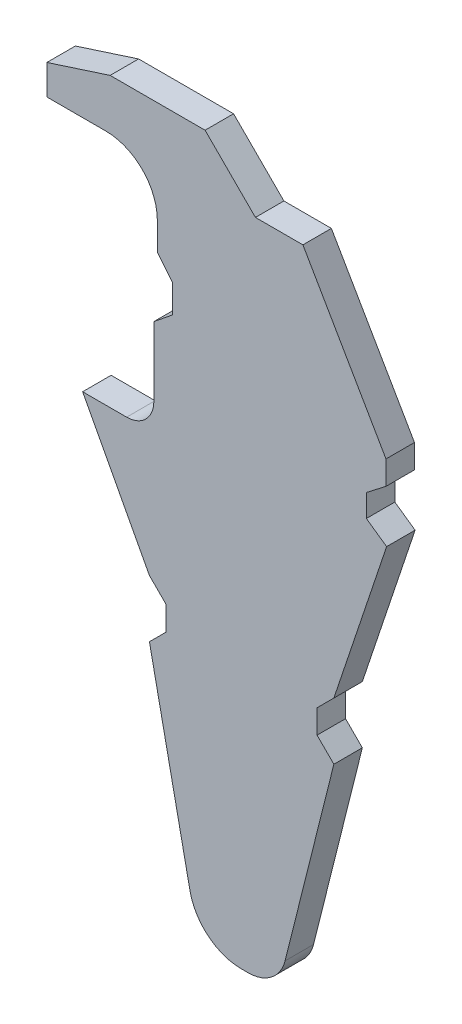
ISO-10303-21;
HEADER;
FILE_DESCRIPTION(('STEP AP214'),'2;1');
FILE_NAME('part.step','',(''),(''),'','','');
FILE_SCHEMA(('AUTOMOTIVE_DESIGN { 1 0 10303 214 1 1 1 1 }'));
ENDSEC;
DATA;
#1=APPLICATION_CONTEXT('core data for automotive mechanical design processes');
#2=APPLICATION_PROTOCOL_DEFINITION('international standard','automotive_design',2000,#1);
#3=PRODUCT_CONTEXT('',#1,'mechanical');
#4=PRODUCT('Part','Part','',(#3));
#5=PRODUCT_RELATED_PRODUCT_CATEGORY('part','',(#4));
#6=PRODUCT_DEFINITION_FORMATION('','',#4);
#7=PRODUCT_DEFINITION_CONTEXT('part definition',#1,'design');
#8=PRODUCT_DEFINITION('design','',#6,#7);
#9=PRODUCT_DEFINITION_SHAPE('','',#8);
#10=(LENGTH_UNIT() NAMED_UNIT(*) SI_UNIT(.MILLI.,.METRE.));
#11=(NAMED_UNIT(*) PLANE_ANGLE_UNIT() SI_UNIT($,.RADIAN.));
#12=(NAMED_UNIT(*) SI_UNIT($,.STERADIAN.) SOLID_ANGLE_UNIT());
#13=UNCERTAINTY_MEASURE_WITH_UNIT(LENGTH_MEASURE(1.E-05),#10,'distance_accuracy_value','');
#14=(GEOMETRIC_REPRESENTATION_CONTEXT(3) GLOBAL_UNCERTAINTY_ASSIGNED_CONTEXT((#13)) GLOBAL_UNIT_ASSIGNED_CONTEXT((#10,
#11,#12)) REPRESENTATION_CONTEXT('',''));
#15=CARTESIAN_POINT('',(0.,0.,0.));
#16=DIRECTION('',(0.,0.,1.));
#17=DIRECTION('',(1.,0.,0.));
#18=AXIS2_PLACEMENT_3D('',#15,#16,#17);
#19=CARTESIAN_POINT('',(-67.2955021445661,57.9711855069026,6.));
#20=DIRECTION('',(0.307214021508305,-0.951640449428614,0.));
#21=DIRECTION('',(0.951640449428614,0.307214021508305,0.));
#22=AXIS2_PLACEMENT_3D('',#19,#20,#21);
#23=PLANE('',#22);
#24=DIRECTION('',(-0.951640449428614,-0.307214021508305,0.));
#25=VECTOR('',#24,1.);
#26=CARTESIAN_POINT('',(-67.2955021445661,57.9711855069026,0.));
#27=LINE('',#26,#25);
#28=CARTESIAN_POINT('',(-53.9725358525655,62.2721818080188,0.));
#29=VERTEX_POINT('',#28);
#30=CARTESIAN_POINT('',(-67.2955021445661,57.9711855069026,0.));
#31=VERTEX_POINT('',#30);
#32=EDGE_CURVE('E273',#29,#31,#27,.T.);
#33=ORIENTED_EDGE('',*,*,#32,.T.);
#34=DIRECTION('',(0.,0.,-1.));
#35=VECTOR('',#34,1.);
#36=CARTESIAN_POINT('',(-67.2955021445661,57.9711855069026,6.));
#37=LINE('',#36,#35);
#38=CARTESIAN_POINT('',(-67.2955021445661,57.9711855069026,6.));
#39=VERTEX_POINT('',#38);
#40=EDGE_CURVE('E11',#39,#31,#37,.T.);
#41=ORIENTED_EDGE('',*,*,#40,.F.);
#42=DIRECTION('',(-0.951640449428614,-0.307214021508305,0.));
#43=VECTOR('',#42,1.);
#44=CARTESIAN_POINT('',(-67.2955021445661,57.9711855069026,6.));
#45=LINE('',#44,#43);
#46=CARTESIAN_POINT('',(-53.9725358525655,62.2721818080188,6.));
#47=VERTEX_POINT('',#46);
#48=EDGE_CURVE('E335',#47,#39,#45,.T.);
#49=ORIENTED_EDGE('',*,*,#48,.F.);
#50=DIRECTION('',(0.,0.,-1.));
#51=VECTOR('',#50,1.);
#52=CARTESIAN_POINT('',(-53.9725358525655,62.2721818080188,6.));
#53=LINE('',#52,#51);
#54=EDGE_CURVE('E269',#47,#29,#53,.T.);
#55=ORIENTED_EDGE('',*,*,#54,.T.);
#56=EDGE_LOOP('',(#33,#41,#49,#55));
#57=FACE_BOUND('',#56,.T.);
#58=ADVANCED_FACE('F33',(#57),#23,.F.);
#59=CARTESIAN_POINT('',(-67.2955021445661,57.9711855069026,6.));
#60=DIRECTION('',(1.,0.,0.));
#61=DIRECTION('',(0.,0.,-1.));
#62=AXIS2_PLACEMENT_3D('',#59,#60,#61);
#63=PLANE('',#62);
#64=DIRECTION('',(0.,-1.,0.));
#65=VECTOR('',#64,1.);
#66=CARTESIAN_POINT('',(-67.2955021445661,57.9711855069026,0.));
#67=LINE('',#66,#65);
#68=CARTESIAN_POINT('',(-67.2955021445661,51.6655800902206,0.));
#69=VERTEX_POINT('',#68);
#70=EDGE_CURVE('E276',#31,#69,#67,.T.);
#71=ORIENTED_EDGE('',*,*,#70,.T.);
#72=DIRECTION('',(0.,0.,-1.));
#73=VECTOR('',#72,1.);
#74=CARTESIAN_POINT('',(-67.2955021445661,51.6655800902206,6.));
#75=LINE('',#74,#73);
#76=CARTESIAN_POINT('',(-67.2955021445661,51.6655800902206,6.));
#77=VERTEX_POINT('',#76);
#78=EDGE_CURVE('E41',#77,#69,#75,.T.);
#79=ORIENTED_EDGE('',*,*,#78,.F.);
#80=DIRECTION('',(0.,-1.,0.));
#81=VECTOR('',#80,1.);
#82=CARTESIAN_POINT('',(-67.2955021445661,57.9711855069026,6.));
#83=LINE('',#82,#81);
#84=EDGE_CURVE('E164',#39,#77,#83,.T.);
#85=ORIENTED_EDGE('',*,*,#84,.F.);
#86=ORIENTED_EDGE('',*,*,#40,.T.);
#87=EDGE_LOOP('',(#71,#79,#85,#86));
#88=FACE_BOUND('',#87,.T.);
#89=ADVANCED_FACE('F513',(#88),#63,.F.);
#90=CARTESIAN_POINT('',(-67.2955021445661,51.6655800902206,6.));
#91=DIRECTION('',(0.,1.,0.));
#92=DIRECTION('',(0.,0.,1.));
#93=AXIS2_PLACEMENT_3D('',#90,#91,#92);
#94=PLANE('',#93);
#95=DIRECTION('',(1.,0.,0.));
#96=VECTOR('',#95,1.);
#97=CARTESIAN_POINT('',(-67.2955021445661,51.6655800902206,0.));
#98=LINE('',#97,#96);
#99=CARTESIAN_POINT('',(-54.8708551394031,51.6655800902206,0.));
#100=VERTEX_POINT('',#99);
#101=EDGE_CURVE('E278',#69,#100,#98,.T.);
#102=ORIENTED_EDGE('',*,*,#101,.T.);
#103=DIRECTION('',(0.,0.,-1.));
#104=VECTOR('',#103,1.);
#105=CARTESIAN_POINT('',(-54.8708551394031,51.6655800902206,6.));
#106=LINE('',#105,#104);
#107=CARTESIAN_POINT('',(-54.8708551394031,51.6655800902206,6.));
#108=VERTEX_POINT('',#107);
#109=EDGE_CURVE('E414',#108,#100,#106,.T.);
#110=ORIENTED_EDGE('',*,*,#109,.F.);
#111=DIRECTION('',(1.,0.,0.));
#112=VECTOR('',#111,1.);
#113=CARTESIAN_POINT('',(-67.2955021445661,51.6655800902206,6.));
#114=LINE('',#113,#112);
#115=EDGE_CURVE('E422',#77,#108,#114,.T.);
#116=ORIENTED_EDGE('',*,*,#115,.F.);
#117=ORIENTED_EDGE('',*,*,#78,.T.);
#118=EDGE_LOOP('',(#102,#110,#116,#117));
#119=FACE_BOUND('',#118,.T.);
#120=ADVANCED_FACE('F420',(#119),#94,.F.);
#121=CARTESIAN_POINT('',(-54.8708551394031,40.8223313035777,6.));
#122=DIRECTION('',(0.,0.,-1.));
#123=DIRECTION('',(-1.,0.,0.));
#124=AXIS2_PLACEMENT_3D('',#121,#122,#123);
#125=CYLINDRICAL_SURFACE('',#124,10.8432487866429);
#126=CARTESIAN_POINT('',(-54.8708551394031,40.8223313035777,0.));
#127=DIRECTION('',(0.,0.,-1.));
#128=DIRECTION('',(-1.,0.,0.));
#129=AXIS2_PLACEMENT_3D('',#126,#127,#128);
#130=CIRCLE('',#129,10.8432487866429);
#131=CARTESIAN_POINT('',(-44.0276063527602,40.8223313035777,0.));
#132=VERTEX_POINT('',#131);
#133=EDGE_CURVE('E280',#100,#132,#130,.T.);
#134=ORIENTED_EDGE('',*,*,#133,.T.);
#135=DIRECTION('',(0.,0.,-1.));
#136=VECTOR('',#135,1.);
#137=CARTESIAN_POINT('',(-44.0276063527602,40.8223313035777,6.));
#138=LINE('',#137,#136);
#139=CARTESIAN_POINT('',(-44.0276063527602,40.8223313035777,6.));
#140=VERTEX_POINT('',#139);
#141=EDGE_CURVE('E411',#140,#132,#138,.T.);
#142=ORIENTED_EDGE('',*,*,#141,.F.);
#143=CARTESIAN_POINT('',(-54.8708551394031,40.8223313035777,6.));
#144=DIRECTION('',(0.,0.,-1.));
#145=DIRECTION('',(-1.,0.,0.));
#146=AXIS2_PLACEMENT_3D('',#143,#144,#145);
#147=CIRCLE('',#146,10.8432487866429);
#148=EDGE_CURVE('E440',#108,#140,#147,.T.);
#149=ORIENTED_EDGE('',*,*,#148,.F.);
#150=ORIENTED_EDGE('',*,*,#109,.T.);
#151=EDGE_LOOP('',(#134,#142,#149,#150));
#152=FACE_BOUND('',#151,.T.);
#153=ADVANCED_FACE('F431',(#152),#125,.F.);
#154=CARTESIAN_POINT('',(-44.0276063527602,40.8223313035777,6.));
#155=DIRECTION('',(1.,0.,0.));
#156=DIRECTION('',(0.,0.,-1.));
#157=AXIS2_PLACEMENT_3D('',#154,#155,#156);
#158=PLANE('',#157);
#159=DIRECTION('',(0.,-1.,0.));
#160=VECTOR('',#159,1.);
#161=CARTESIAN_POINT('',(-44.0276063527602,40.8223313035777,0.));
#162=LINE('',#161,#160);
#163=CARTESIAN_POINT('',(-44.0276063527602,34.9937885514415,0.));
#164=VERTEX_POINT('',#163);
#165=EDGE_CURVE('E282',#132,#164,#162,.T.);
#166=ORIENTED_EDGE('',*,*,#165,.T.);
#167=DIRECTION('',(0.,0.,-1.));
#168=VECTOR('',#167,1.);
#169=CARTESIAN_POINT('',(-44.0276063527602,34.9937885514415,6.));
#170=LINE('',#169,#168);
#171=CARTESIAN_POINT('',(-44.0276063527602,34.9937885514415,6.));
#172=VERTEX_POINT('',#171);
#173=EDGE_CURVE('E408',#172,#164,#170,.T.);
#174=ORIENTED_EDGE('',*,*,#173,.F.);
#175=DIRECTION('',(0.,-1.,0.));
#176=VECTOR('',#175,1.);
#177=CARTESIAN_POINT('',(-44.0276063527602,40.8223313035777,6.));
#178=LINE('',#177,#176);
#179=EDGE_CURVE('E437',#140,#172,#178,.T.);
#180=ORIENTED_EDGE('',*,*,#179,.F.);
#181=ORIENTED_EDGE('',*,*,#141,.T.);
#182=EDGE_LOOP('',(#166,#174,#180,#181));
#183=FACE_BOUND('',#182,.T.);
#184=ADVANCED_FACE('F435',(#183),#158,.F.);
#185=CARTESIAN_POINT('',(-40.8811187330478,31.1079661598501,6.));
#186=DIRECTION('',(0.777164478318329,0.629297523942531,0.));
#187=DIRECTION('',(-0.629297523942531,0.777164478318329,0.));
#188=AXIS2_PLACEMENT_3D('',#185,#186,#187);
#189=PLANE('',#188);
#190=DIRECTION('',(0.629297523942531,-0.777164478318329,0.));
#191=VECTOR('',#190,1.);
#192=CARTESIAN_POINT('',(-40.8811187330478,31.1079661598501,0.));
#193=LINE('',#192,#191);
#194=CARTESIAN_POINT('',(-40.8811187330478,31.1079661598501,0.));
#195=VERTEX_POINT('',#194);
#196=EDGE_CURVE('E284',#164,#195,#193,.T.);
#197=ORIENTED_EDGE('',*,*,#196,.T.);
#198=DIRECTION('',(0.,0.,-1.));
#199=VECTOR('',#198,1.);
#200=CARTESIAN_POINT('',(-40.8811187330478,31.1079661598501,6.));
#201=LINE('',#200,#199);
#202=CARTESIAN_POINT('',(-40.8811187330478,31.1079661598501,6.));
#203=VERTEX_POINT('',#202);
#204=EDGE_CURVE('E405',#203,#195,#201,.T.);
#205=ORIENTED_EDGE('',*,*,#204,.F.);
#206=DIRECTION('',(0.629297523942531,-0.777164478318329,0.));
#207=VECTOR('',#206,1.);
#208=CARTESIAN_POINT('',(-40.8811187330478,31.1079661598501,6.));
#209=LINE('',#208,#207);
#210=EDGE_CURVE('E439',#172,#203,#209,.T.);
#211=ORIENTED_EDGE('',*,*,#210,.F.);
#212=ORIENTED_EDGE('',*,*,#173,.T.);
#213=EDGE_LOOP('',(#197,#205,#211,#212));
#214=FACE_BOUND('',#213,.T.);
#215=ADVANCED_FACE('F526',(#214),#189,.F.);
#216=CARTESIAN_POINT('',(-40.8811187330478,25.1079661598501,6.));
#217=DIRECTION('',(1.,0.,0.));
#218=DIRECTION('',(0.,0.,-1.));
#219=AXIS2_PLACEMENT_3D('',#216,#217,#218);
#220=PLANE('',#219);
#221=DIRECTION('',(0.,-1.,0.));
#222=VECTOR('',#221,1.);
#223=CARTESIAN_POINT('',(-40.8811187330478,25.1079661598501,0.));
#224=LINE('',#223,#222);
#225=CARTESIAN_POINT('',(-40.8811187330478,25.1079661598501,0.));
#226=VERTEX_POINT('',#225);
#227=EDGE_CURVE('E286',#195,#226,#224,.T.);
#228=ORIENTED_EDGE('',*,*,#227,.T.);
#229=DIRECTION('',(0.,0.,-1.));
#230=VECTOR('',#229,1.);
#231=CARTESIAN_POINT('',(-40.8811187330478,25.1079661598501,6.));
#232=LINE('',#231,#230);
#233=CARTESIAN_POINT('',(-40.8811187330478,25.1079661598501,6.));
#234=VERTEX_POINT('',#233);
#235=EDGE_CURVE('E402',#234,#226,#232,.T.);
#236=ORIENTED_EDGE('',*,*,#235,.F.);
#237=DIRECTION('',(0.,-1.,0.));
#238=VECTOR('',#237,1.);
#239=CARTESIAN_POINT('',(-40.8811187330478,25.1079661598501,6.));
#240=LINE('',#239,#238);
#241=EDGE_CURVE('E442',#203,#234,#240,.T.);
#242=ORIENTED_EDGE('',*,*,#241,.F.);
#243=ORIENTED_EDGE('',*,*,#204,.T.);
#244=EDGE_LOOP('',(#228,#236,#242,#243));
#245=FACE_BOUND('',#244,.T.);
#246=ADVANCED_FACE('F529',(#245),#220,.F.);
#247=CARTESIAN_POINT('',(-44.7669411246306,21.9614785401446,6.));
#248=DIRECTION('',(0.62929752394253,-0.777164478318329,0.));
#249=DIRECTION('',(0.777164478318329,0.62929752394253,0.));
#250=AXIS2_PLACEMENT_3D('',#247,#248,#249);
#251=PLANE('',#250);
#252=DIRECTION('',(-0.777164478318329,-0.62929752394253,0.));
#253=VECTOR('',#252,1.);
#254=CARTESIAN_POINT('',(-44.7669411246306,21.9614785401446,0.));
#255=LINE('',#254,#253);
#256=CARTESIAN_POINT('',(-44.7669411246306,21.9614785401446,0.));
#257=VERTEX_POINT('',#256);
#258=EDGE_CURVE('E288',#226,#257,#255,.T.);
#259=ORIENTED_EDGE('',*,*,#258,.T.);
#260=DIRECTION('',(0.,0.,-1.));
#261=VECTOR('',#260,1.);
#262=CARTESIAN_POINT('',(-44.7669411246306,21.9614785401446,6.));
#263=LINE('',#262,#261);
#264=CARTESIAN_POINT('',(-44.7669411246306,21.9614785401446,6.));
#265=VERTEX_POINT('',#264);
#266=EDGE_CURVE('E399',#265,#257,#263,.T.);
#267=ORIENTED_EDGE('',*,*,#266,.F.);
#268=DIRECTION('',(-0.777164478318329,-0.62929752394253,0.));
#269=VECTOR('',#268,1.);
#270=CARTESIAN_POINT('',(-44.7669411246306,21.9614785401446,6.));
#271=LINE('',#270,#269);
#272=EDGE_CURVE('E448',#234,#265,#271,.T.);
#273=ORIENTED_EDGE('',*,*,#272,.F.);
#274=ORIENTED_EDGE('',*,*,#235,.T.);
#275=EDGE_LOOP('',(#259,#267,#273,#274));
#276=FACE_BOUND('',#275,.T.);
#277=ADVANCED_FACE('F533',(#276),#251,.F.);
#278=CARTESIAN_POINT('',(-44.7669411246306,7.39300723371176,6.));
#279=DIRECTION('',(1.,0.,0.));
#280=DIRECTION('',(0.,0.,-1.));
#281=AXIS2_PLACEMENT_3D('',#278,#279,#280);
#282=PLANE('',#281);
#283=DIRECTION('',(0.,-1.,0.));
#284=VECTOR('',#283,1.);
#285=CARTESIAN_POINT('',(-44.7669411246306,7.39300723371176,0.));
#286=LINE('',#285,#284);
#287=CARTESIAN_POINT('',(-44.7669411246306,7.39300723371176,0.));
#288=VERTEX_POINT('',#287);
#289=EDGE_CURVE('E290',#257,#288,#286,.T.);
#290=ORIENTED_EDGE('',*,*,#289,.T.);
#291=DIRECTION('',(0.,0.,-1.));
#292=VECTOR('',#291,1.);
#293=CARTESIAN_POINT('',(-44.7669411246306,7.39300723371176,6.));
#294=LINE('',#293,#292);
#295=CARTESIAN_POINT('',(-44.7669411246306,7.39300723371176,6.));
#296=VERTEX_POINT('',#295);
#297=EDGE_CURVE('E396',#296,#288,#294,.T.);
#298=ORIENTED_EDGE('',*,*,#297,.F.);
#299=DIRECTION('',(0.,-1.,0.));
#300=VECTOR('',#299,1.);
#301=CARTESIAN_POINT('',(-44.7669411246306,7.39300723371176,6.));
#302=LINE('',#301,#300);
#303=EDGE_CURVE('E450',#265,#296,#302,.T.);
#304=ORIENTED_EDGE('',*,*,#303,.F.);
#305=ORIENTED_EDGE('',*,*,#266,.T.);
#306=EDGE_LOOP('',(#290,#298,#304,#305));
#307=FACE_BOUND('',#306,.T.);
#308=ADVANCED_FACE('F537',(#307),#282,.F.);
#309=CARTESIAN_POINT('',(-50.494368268119,7.39300723371176,6.));
#310=DIRECTION('',(0.,0.,-1.));
#311=DIRECTION('',(-1.,0.,0.));
#312=AXIS2_PLACEMENT_3D('',#309,#310,#311);
#313=CYLINDRICAL_SURFACE('',#312,5.72742714348842);
#314=CARTESIAN_POINT('',(-50.494368268119,7.39300723371176,0.));
#315=DIRECTION('',(0.,0.,-1.));
#316=DIRECTION('',(-1.,0.,0.));
#317=AXIS2_PLACEMENT_3D('',#314,#315,#316);
#318=CIRCLE('',#317,5.72742714348842);
#319=CARTESIAN_POINT('',(-50.494368268119,1.66558009022334,0.));
#320=VERTEX_POINT('',#319);
#321=EDGE_CURVE('E292',#288,#320,#318,.T.);
#322=ORIENTED_EDGE('',*,*,#321,.T.);
#323=DIRECTION('',(0.,0.,-1.));
#324=VECTOR('',#323,1.);
#325=CARTESIAN_POINT('',(-50.494368268119,1.66558009022334,6.));
#326=LINE('',#325,#324);
#327=CARTESIAN_POINT('',(-50.494368268119,1.66558009022334,6.));
#328=VERTEX_POINT('',#327);
#329=EDGE_CURVE('E393',#328,#320,#326,.T.);
#330=ORIENTED_EDGE('',*,*,#329,.F.);
#331=CARTESIAN_POINT('',(-50.494368268119,7.39300723371176,6.));
#332=DIRECTION('',(0.,0.,-1.));
#333=DIRECTION('',(-1.,0.,0.));
#334=AXIS2_PLACEMENT_3D('',#331,#332,#333);
#335=CIRCLE('',#334,5.72742714348842);
#336=EDGE_CURVE('E452',#296,#328,#335,.T.);
#337=ORIENTED_EDGE('',*,*,#336,.F.);
#338=ORIENTED_EDGE('',*,*,#297,.T.);
#339=EDGE_LOOP('',(#322,#330,#337,#338));
#340=FACE_BOUND('',#339,.T.);
#341=ADVANCED_FACE('F541',(#340),#313,.F.);
#342=CARTESIAN_POINT('',(-59.766941124571,1.66558009022334,6.));
#343=DIRECTION('',(0.,-1.,0.));
#344=DIRECTION('',(0.,0.,-1.));
#345=AXIS2_PLACEMENT_3D('',#342,#343,#344);
#346=PLANE('',#345);
#347=DIRECTION('',(-1.,0.,0.));
#348=VECTOR('',#347,1.);
#349=CARTESIAN_POINT('',(-59.766941124571,1.66558009022334,0.));
#350=LINE('',#349,#348);
#351=CARTESIAN_POINT('',(-59.766941124571,1.66558009022334,0.));
#352=VERTEX_POINT('',#351);
#353=EDGE_CURVE('E294',#320,#352,#350,.T.);
#354=ORIENTED_EDGE('',*,*,#353,.T.);
#355=DIRECTION('',(0.,0.,-1.));
#356=VECTOR('',#355,1.);
#357=CARTESIAN_POINT('',(-59.766941124571,1.66558009022334,6.));
#358=LINE('',#357,#356);
#359=CARTESIAN_POINT('',(-59.766941124571,1.66558009022334,6.));
#360=VERTEX_POINT('',#359);
#361=EDGE_CURVE('E390',#360,#352,#358,.T.);
#362=ORIENTED_EDGE('',*,*,#361,.F.);
#363=DIRECTION('',(-1.,0.,0.));
#364=VECTOR('',#363,1.);
#365=CARTESIAN_POINT('',(-59.766941124571,1.66558009022334,6.));
#366=LINE('',#365,#364);
#367=EDGE_CURVE('E454',#328,#360,#366,.T.);
#368=ORIENTED_EDGE('',*,*,#367,.F.);
#369=ORIENTED_EDGE('',*,*,#329,.T.);
#370=EDGE_LOOP('',(#354,#362,#368,#369));
#371=FACE_BOUND('',#370,.T.);
#372=ADVANCED_FACE('F545',(#371),#346,.F.);
#373=CARTESIAN_POINT('',(-45.6938917048381,-24.8287453405136,6.));
#374=DIRECTION('',(0.883144181024546,0.469101647324419,0.));
#375=DIRECTION('',(-0.469101647324419,0.883144181024546,0.));
#376=AXIS2_PLACEMENT_3D('',#373,#374,#375);
#377=PLANE('',#376);
#378=DIRECTION('',(0.469101647324419,-0.883144181024546,0.));
#379=VECTOR('',#378,1.);
#380=CARTESIAN_POINT('',(-45.6938917048381,-24.8287453405136,0.));
#381=LINE('',#380,#379);
#382=CARTESIAN_POINT('',(-45.6938917048381,-24.8287453405136,0.));
#383=VERTEX_POINT('',#382);
#384=EDGE_CURVE('E296',#352,#383,#381,.T.);
#385=ORIENTED_EDGE('',*,*,#384,.T.);
#386=DIRECTION('',(0.,0.,-1.));
#387=VECTOR('',#386,1.);
#388=CARTESIAN_POINT('',(-45.6938917048381,-24.8287453405136,6.));
#389=LINE('',#388,#387);
#390=CARTESIAN_POINT('',(-45.6938917048381,-24.8287453405136,6.));
#391=VERTEX_POINT('',#390);
#392=EDGE_CURVE('E387',#391,#383,#389,.T.);
#393=ORIENTED_EDGE('',*,*,#392,.F.);
#394=DIRECTION('',(0.469101647324419,-0.883144181024546,0.));
#395=VECTOR('',#394,1.);
#396=CARTESIAN_POINT('',(-45.6938917048381,-24.8287453405136,6.));
#397=LINE('',#396,#395);
#398=EDGE_CURVE('E456',#360,#391,#397,.T.);
#399=ORIENTED_EDGE('',*,*,#398,.F.);
#400=ORIENTED_EDGE('',*,*,#361,.T.);
#401=EDGE_LOOP('',(#385,#393,#399,#400));
#402=FACE_BOUND('',#401,.T.);
#403=ADVANCED_FACE('F549',(#402),#377,.F.);
#404=CARTESIAN_POINT('',(-42.1583577989055,-28.3642792464463,6.));
#405=DIRECTION('',(0.707106781186548,0.707106781186548,0.));
#406=DIRECTION('',(-0.707106781186548,0.707106781186548,0.));
#407=AXIS2_PLACEMENT_3D('',#404,#405,#406);
#408=PLANE('',#407);
#409=DIRECTION('',(0.707106781186547,-0.707106781186547,0.));
#410=VECTOR('',#409,1.);
#411=CARTESIAN_POINT('',(-42.1583577989055,-28.3642792464463,0.));
#412=LINE('',#411,#410);
#413=CARTESIAN_POINT('',(-42.1583577989055,-28.3642792464463,0.));
#414=VERTEX_POINT('',#413);
#415=EDGE_CURVE('E298',#383,#414,#412,.T.);
#416=ORIENTED_EDGE('',*,*,#415,.T.);
#417=DIRECTION('',(0.,0.,-1.));
#418=VECTOR('',#417,1.);
#419=CARTESIAN_POINT('',(-42.1583577989055,-28.3642792464463,6.));
#420=LINE('',#419,#418);
#421=CARTESIAN_POINT('',(-42.1583577989055,-28.3642792464463,6.));
#422=VERTEX_POINT('',#421);
#423=EDGE_CURVE('E384',#422,#414,#420,.T.);
#424=ORIENTED_EDGE('',*,*,#423,.F.);
#425=DIRECTION('',(0.707106781186547,-0.707106781186547,0.));
#426=VECTOR('',#425,1.);
#427=CARTESIAN_POINT('',(-42.1583577989055,-28.3642792464463,6.));
#428=LINE('',#427,#426);
#429=EDGE_CURVE('E458',#391,#422,#428,.T.);
#430=ORIENTED_EDGE('',*,*,#429,.F.);
#431=ORIENTED_EDGE('',*,*,#392,.T.);
#432=EDGE_LOOP('',(#416,#424,#430,#431));
#433=FACE_BOUND('',#432,.T.);
#434=ADVANCED_FACE('F553',(#433),#408,.F.);
#435=CARTESIAN_POINT('',(-42.1583577989055,-33.3642792464465,6.));
#436=DIRECTION('',(1.,0.,0.));
#437=DIRECTION('',(0.,0.,-1.));
#438=AXIS2_PLACEMENT_3D('',#435,#436,#437);
#439=PLANE('',#438);
#440=DIRECTION('',(0.,-1.,0.));
#441=VECTOR('',#440,1.);
#442=CARTESIAN_POINT('',(-42.1583577989055,-33.3642792464465,0.));
#443=LINE('',#442,#441);
#444=CARTESIAN_POINT('',(-42.1583577989055,-33.3642792464465,0.));
#445=VERTEX_POINT('',#444);
#446=EDGE_CURVE('E300',#414,#445,#443,.T.);
#447=ORIENTED_EDGE('',*,*,#446,.T.);
#448=DIRECTION('',(0.,0.,-1.));
#449=VECTOR('',#448,1.);
#450=CARTESIAN_POINT('',(-42.1583577989055,-33.3642792464465,6.));
#451=LINE('',#450,#449);
#452=CARTESIAN_POINT('',(-42.1583577989055,-33.3642792464465,6.));
#453=VERTEX_POINT('',#452);
#454=EDGE_CURVE('E381',#453,#445,#451,.T.);
#455=ORIENTED_EDGE('',*,*,#454,.F.);
#456=DIRECTION('',(0.,-1.,0.));
#457=VECTOR('',#456,1.);
#458=CARTESIAN_POINT('',(-42.1583577989055,-33.3642792464465,6.));
#459=LINE('',#458,#457);
#460=EDGE_CURVE('E460',#422,#453,#459,.T.);
#461=ORIENTED_EDGE('',*,*,#460,.F.);
#462=ORIENTED_EDGE('',*,*,#423,.T.);
#463=EDGE_LOOP('',(#447,#455,#461,#462));
#464=FACE_BOUND('',#463,.T.);
#465=ADVANCED_FACE('F557',(#464),#439,.F.);
#466=CARTESIAN_POINT('',(-45.6938917048383,-36.8998131523793,6.));
#467=DIRECTION('',(0.707106781186547,-0.707106781186547,0.));
#468=DIRECTION('',(0.707106781186548,0.707106781186548,0.));
#469=AXIS2_PLACEMENT_3D('',#466,#467,#468);
#470=PLANE('',#469);
#471=DIRECTION('',(-0.707106781186548,-0.707106781186548,0.));
#472=VECTOR('',#471,1.);
#473=CARTESIAN_POINT('',(-45.6938917048383,-36.8998131523793,0.));
#474=LINE('',#473,#472);
#475=CARTESIAN_POINT('',(-45.6938917048383,-36.8998131523793,0.));
#476=VERTEX_POINT('',#475);
#477=EDGE_CURVE('E302',#445,#476,#474,.T.);
#478=ORIENTED_EDGE('',*,*,#477,.T.);
#479=DIRECTION('',(0.,0.,-1.));
#480=VECTOR('',#479,1.);
#481=CARTESIAN_POINT('',(-45.6938917048383,-36.8998131523793,6.));
#482=LINE('',#481,#480);
#483=CARTESIAN_POINT('',(-45.6938917048383,-36.8998131523793,6.));
#484=VERTEX_POINT('',#483);
#485=EDGE_CURVE('E378',#484,#476,#482,.T.);
#486=ORIENTED_EDGE('',*,*,#485,.F.);
#487=DIRECTION('',(-0.707106781186548,-0.707106781186548,0.));
#488=VECTOR('',#487,1.);
#489=CARTESIAN_POINT('',(-45.6938917048383,-36.8998131523793,6.));
#490=LINE('',#489,#488);
#491=EDGE_CURVE('E462',#453,#484,#490,.T.);
#492=ORIENTED_EDGE('',*,*,#491,.F.);
#493=ORIENTED_EDGE('',*,*,#454,.T.);
#494=EDGE_LOOP('',(#478,#486,#492,#493));
#495=FACE_BOUND('',#494,.T.);
#496=ADVANCED_FACE('F561',(#495),#470,.F.);
#497=CARTESIAN_POINT('',(-37.1406993251591,-78.0878104558299,6.));
#498=DIRECTION('',(0.979111410727653,0.203324482989396,0.));
#499=DIRECTION('',(-0.203324482989396,0.979111410727653,0.));
#500=AXIS2_PLACEMENT_3D('',#497,#498,#499);
#501=PLANE('',#500);
#502=DIRECTION('',(0.203324482989396,-0.979111410727653,0.));
#503=VECTOR('',#502,1.);
#504=CARTESIAN_POINT('',(-37.1406993251591,-78.0878104558299,0.));
#505=LINE('',#504,#503);
#506=CARTESIAN_POINT('',(-37.1406993251591,-78.0878104558299,0.));
#507=VERTEX_POINT('',#506);
#508=EDGE_CURVE('E304',#476,#507,#505,.T.);
#509=ORIENTED_EDGE('',*,*,#508,.T.);
#510=DIRECTION('',(0.,0.,-1.));
#511=VECTOR('',#510,1.);
#512=CARTESIAN_POINT('',(-37.1406993251591,-78.0878104558299,6.));
#513=LINE('',#512,#511);
#514=CARTESIAN_POINT('',(-37.1406993251591,-78.0878104558299,6.));
#515=VERTEX_POINT('',#514);
#516=EDGE_CURVE('E375',#515,#507,#513,.T.);
#517=ORIENTED_EDGE('',*,*,#516,.F.);
#518=DIRECTION('',(0.203324482989396,-0.979111410727653,0.));
#519=VECTOR('',#518,1.);
#520=CARTESIAN_POINT('',(-37.1406993251591,-78.0878104558299,6.));
#521=LINE('',#520,#519);
#522=EDGE_CURVE('E464',#484,#515,#521,.T.);
#523=ORIENTED_EDGE('',*,*,#522,.F.);
#524=ORIENTED_EDGE('',*,*,#485,.T.);
#525=EDGE_LOOP('',(#509,#517,#523,#524));
#526=FACE_BOUND('',#525,.T.);
#527=ADVANCED_FACE('F565',(#526),#501,.F.);
#528=CARTESIAN_POINT('',(-26.3107789782547,-75.8388447801932,6.));
#529=DIRECTION('',(0.,0.,-1.));
#530=DIRECTION('',(-1.,0.,0.));
#531=AXIS2_PLACEMENT_3D('',#528,#529,#530);
#532=CYLINDRICAL_SURFACE('',#531,11.0609683721854);
#533=CARTESIAN_POINT('',(-26.3107789782547,-75.8388447801932,0.));
#534=DIRECTION('',(0.,0.,1.));
#535=DIRECTION('',(1.,0.,0.));
#536=AXIS2_PLACEMENT_3D('',#533,#534,#535);
#537=CIRCLE('',#536,11.0609683721854);
#538=CARTESIAN_POINT('',(-26.3107789782547,-86.8998131523786,0.));
#539=VERTEX_POINT('',#538);
#540=EDGE_CURVE('E306',#507,#539,#537,.T.);
#541=ORIENTED_EDGE('',*,*,#540,.T.);
#542=DIRECTION('',(0.,0.,-1.));
#543=VECTOR('',#542,1.);
#544=CARTESIAN_POINT('',(-26.3107789782547,-86.8998131523786,6.));
#545=LINE('',#544,#543);
#546=CARTESIAN_POINT('',(-26.3107789782547,-86.8998131523786,6.));
#547=VERTEX_POINT('',#546);
#548=EDGE_CURVE('E372',#547,#539,#545,.T.);
#549=ORIENTED_EDGE('',*,*,#548,.F.);
#550=CARTESIAN_POINT('',(-26.3107789782547,-75.8388447801932,6.));
#551=DIRECTION('',(0.,0.,1.));
#552=DIRECTION('',(1.,0.,0.));
#553=AXIS2_PLACEMENT_3D('',#550,#551,#552);
#554=CIRCLE('',#553,11.0609683721854);
#555=EDGE_CURVE('E466',#515,#547,#554,.T.);
#556=ORIENTED_EDGE('',*,*,#555,.F.);
#557=ORIENTED_EDGE('',*,*,#516,.T.);
#558=EDGE_LOOP('',(#541,#549,#556,#557));
#559=FACE_BOUND('',#558,.T.);
#560=ADVANCED_FACE('F569',(#559),#532,.T.);
#561=CARTESIAN_POINT('',(-24.883760746022,-86.8998131523786,6.));
#562=DIRECTION('',(0.,1.,0.));
#563=DIRECTION('',(0.,0.,1.));
#564=AXIS2_PLACEMENT_3D('',#561,#562,#563);
#565=PLANE('',#564);
#566=DIRECTION('',(1.,0.,0.));
#567=VECTOR('',#566,1.);
#568=CARTESIAN_POINT('',(-24.883760746022,-86.8998131523786,0.));
#569=LINE('',#568,#567);
#570=CARTESIAN_POINT('',(-24.883760746022,-86.8998131523786,0.));
#571=VERTEX_POINT('',#570);
#572=EDGE_CURVE('E308',#539,#571,#569,.T.);
#573=ORIENTED_EDGE('',*,*,#572,.T.);
#574=DIRECTION('',(0.,0.,-1.));
#575=VECTOR('',#574,1.);
#576=CARTESIAN_POINT('',(-24.883760746022,-86.8998131523786,6.));
#577=LINE('',#576,#575);
#578=CARTESIAN_POINT('',(-24.883760746022,-86.8998131523786,6.));
#579=VERTEX_POINT('',#578);
#580=EDGE_CURVE('E369',#579,#571,#577,.T.);
#581=ORIENTED_EDGE('',*,*,#580,.F.);
#582=DIRECTION('',(1.,0.,0.));
#583=VECTOR('',#582,1.);
#584=CARTESIAN_POINT('',(-24.883760746022,-86.8998131523786,6.));
#585=LINE('',#584,#583);
#586=EDGE_CURVE('E468',#547,#579,#585,.T.);
#587=ORIENTED_EDGE('',*,*,#586,.F.);
#588=ORIENTED_EDGE('',*,*,#548,.T.);
#589=EDGE_LOOP('',(#573,#581,#587,#588));
#590=FACE_BOUND('',#589,.T.);
#591=ADVANCED_FACE('F573',(#590),#565,.F.);
#592=CARTESIAN_POINT('',(-24.883760746022,-78.8998131523774,6.));
#593=DIRECTION('',(0.,0.,-1.));
#594=DIRECTION('',(-1.,0.,0.));
#595=AXIS2_PLACEMENT_3D('',#592,#593,#594);
#596=CYLINDRICAL_SURFACE('',#595,8.00000000000123);
#597=CARTESIAN_POINT('',(-24.883760746022,-78.8998131523774,0.));
#598=DIRECTION('',(0.,0.,1.));
#599=DIRECTION('',(-1.,0.,0.));
#600=AXIS2_PLACEMENT_3D('',#597,#598,#599);
#601=CIRCLE('',#600,8.00000000000123);
#602=CARTESIAN_POINT('',(-17.1236857184495,-80.844353089346,0.));
#603=VERTEX_POINT('',#602);
#604=EDGE_CURVE('E310',#571,#603,#601,.T.);
#605=ORIENTED_EDGE('',*,*,#604,.T.);
#606=DIRECTION('',(0.,0.,-1.));
#607=VECTOR('',#606,1.);
#608=CARTESIAN_POINT('',(-17.1236857184495,-80.844353089346,6.));
#609=LINE('',#608,#607);
#610=CARTESIAN_POINT('',(-17.1236857184495,-80.844353089346,6.));
#611=VERTEX_POINT('',#610);
#612=EDGE_CURVE('E366',#611,#603,#609,.T.);
#613=ORIENTED_EDGE('',*,*,#612,.F.);
#614=CARTESIAN_POINT('',(-24.883760746022,-78.8998131523774,6.));
#615=DIRECTION('',(0.,0.,1.));
#616=DIRECTION('',(-1.,0.,0.));
#617=AXIS2_PLACEMENT_3D('',#614,#615,#616);
#618=CIRCLE('',#617,8.00000000000123);
#619=EDGE_CURVE('E470',#579,#611,#618,.T.);
#620=ORIENTED_EDGE('',*,*,#619,.F.);
#621=ORIENTED_EDGE('',*,*,#580,.T.);
#622=EDGE_LOOP('',(#605,#613,#620,#621));
#623=FACE_BOUND('',#622,.T.);
#624=ADVANCED_FACE('F577',(#623),#596,.T.);
#625=CARTESIAN_POINT('',(-6.84534425156621,-39.8265784344514,6.));
#626=DIRECTION('',(-0.970009378446407,0.243067492121045,0.));
#627=DIRECTION('',(-0.243067492121045,-0.970009378446407,0.));
#628=AXIS2_PLACEMENT_3D('',#625,#626,#627);
#629=PLANE('',#628);
#630=DIRECTION('',(0.243067492121045,0.970009378446407,0.));
#631=VECTOR('',#630,1.);
#632=CARTESIAN_POINT('',(-6.84534425156621,-39.8265784344514,0.));
#633=LINE('',#632,#631);
#634=CARTESIAN_POINT('',(-6.84534425156621,-39.8265784344514,0.));
#635=VERTEX_POINT('',#634);
#636=EDGE_CURVE('E312',#603,#635,#633,.T.);
#637=ORIENTED_EDGE('',*,*,#636,.T.);
#638=DIRECTION('',(0.,0.,-1.));
#639=VECTOR('',#638,1.);
#640=CARTESIAN_POINT('',(-6.84534425156621,-39.8265784344514,6.));
#641=LINE('',#640,#639);
#642=CARTESIAN_POINT('',(-6.84534425156621,-39.8265784344514,6.));
#643=VERTEX_POINT('',#642);
#644=EDGE_CURVE('E363',#643,#635,#641,.T.);
#645=ORIENTED_EDGE('',*,*,#644,.F.);
#646=DIRECTION('',(0.243067492121045,0.970009378446407,0.));
#647=VECTOR('',#646,1.);
#648=CARTESIAN_POINT('',(-6.84534425156621,-39.8265784344514,6.));
#649=LINE('',#648,#647);
#650=EDGE_CURVE('E472',#611,#643,#649,.T.);
#651=ORIENTED_EDGE('',*,*,#650,.F.);
#652=ORIENTED_EDGE('',*,*,#612,.T.);
#653=EDGE_LOOP('',(#637,#645,#651,#652));
#654=FACE_BOUND('',#653,.T.);
#655=ADVANCED_FACE('F581',(#654),#629,.F.);
#656=CARTESIAN_POINT('',(-10.3808781574989,-36.2910445285188,6.));
#657=DIRECTION('',(-0.707106781186547,-0.707106781186548,0.));
#658=DIRECTION('',(0.707106781186548,-0.707106781186547,0.));
#659=AXIS2_PLACEMENT_3D('',#656,#657,#658);
#660=PLANE('',#659);
#661=DIRECTION('',(-0.707106781186548,0.707106781186547,0.));
#662=VECTOR('',#661,1.);
#663=CARTESIAN_POINT('',(-10.3808781574989,-36.2910445285188,0.));
#664=LINE('',#663,#662);
#665=CARTESIAN_POINT('',(-10.3808781574989,-36.2910445285188,0.));
#666=VERTEX_POINT('',#665);
#667=EDGE_CURVE('E314',#635,#666,#664,.T.);
#668=ORIENTED_EDGE('',*,*,#667,.T.);
#669=DIRECTION('',(0.,0.,-1.));
#670=VECTOR('',#669,1.);
#671=CARTESIAN_POINT('',(-10.3808781574989,-36.2910445285188,6.));
#672=LINE('',#671,#670);
#673=CARTESIAN_POINT('',(-10.3808781574989,-36.2910445285188,6.));
#674=VERTEX_POINT('',#673);
#675=EDGE_CURVE('E360',#674,#666,#672,.T.);
#676=ORIENTED_EDGE('',*,*,#675,.F.);
#677=DIRECTION('',(-0.707106781186548,0.707106781186547,0.));
#678=VECTOR('',#677,1.);
#679=CARTESIAN_POINT('',(-10.3808781574989,-36.2910445285188,6.));
#680=LINE('',#679,#678);
#681=EDGE_CURVE('E474',#643,#674,#680,.T.);
#682=ORIENTED_EDGE('',*,*,#681,.F.);
#683=ORIENTED_EDGE('',*,*,#644,.T.);
#684=EDGE_LOOP('',(#668,#676,#682,#683));
#685=FACE_BOUND('',#684,.T.);
#686=ADVANCED_FACE('F585',(#685),#660,.F.);
#687=CARTESIAN_POINT('',(-10.3808781574989,-31.2910445285191,6.));
#688=DIRECTION('',(-1.,0.,0.));
#689=DIRECTION('',(0.,0.,1.));
#690=AXIS2_PLACEMENT_3D('',#687,#688,#689);
#691=PLANE('',#690);
#692=DIRECTION('',(0.,1.,0.));
#693=VECTOR('',#692,1.);
#694=CARTESIAN_POINT('',(-10.3808781574989,-31.2910445285191,0.));
#695=LINE('',#694,#693);
#696=CARTESIAN_POINT('',(-10.3808781574989,-31.2910445285191,0.));
#697=VERTEX_POINT('',#696);
#698=EDGE_CURVE('E316',#666,#697,#695,.T.);
#699=ORIENTED_EDGE('',*,*,#698,.T.);
#700=DIRECTION('',(0.,0.,-1.));
#701=VECTOR('',#700,1.);
#702=CARTESIAN_POINT('',(-10.3808781574989,-31.2910445285191,6.));
#703=LINE('',#702,#701);
#704=CARTESIAN_POINT('',(-10.3808781574989,-31.2910445285191,6.));
#705=VERTEX_POINT('',#704);
#706=EDGE_CURVE('E357',#705,#697,#703,.T.);
#707=ORIENTED_EDGE('',*,*,#706,.F.);
#708=DIRECTION('',(0.,1.,0.));
#709=VECTOR('',#708,1.);
#710=CARTESIAN_POINT('',(-10.3808781574989,-31.2910445285191,6.));
#711=LINE('',#710,#709);
#712=EDGE_CURVE('E476',#674,#705,#711,.T.);
#713=ORIENTED_EDGE('',*,*,#712,.F.);
#714=ORIENTED_EDGE('',*,*,#675,.T.);
#715=EDGE_LOOP('',(#699,#707,#713,#714));
#716=FACE_BOUND('',#715,.T.);
#717=ADVANCED_FACE('F589',(#716),#691,.F.);
#718=CARTESIAN_POINT('',(-6.84534425156594,-27.7555106225862,6.));
#719=DIRECTION('',(-0.707106781186547,0.707106781186548,0.));
#720=DIRECTION('',(-0.707106781186548,-0.707106781186547,0.));
#721=AXIS2_PLACEMENT_3D('',#718,#719,#720);
#722=PLANE('',#721);
#723=DIRECTION('',(0.707106781186548,0.707106781186547,0.));
#724=VECTOR('',#723,1.);
#725=CARTESIAN_POINT('',(-6.84534425156594,-27.7555106225862,0.));
#726=LINE('',#725,#724);
#727=CARTESIAN_POINT('',(-6.84534425156594,-27.7555106225862,0.));
#728=VERTEX_POINT('',#727);
#729=EDGE_CURVE('E318',#697,#728,#726,.T.);
#730=ORIENTED_EDGE('',*,*,#729,.T.);
#731=DIRECTION('',(0.,0.,-1.));
#732=VECTOR('',#731,1.);
#733=CARTESIAN_POINT('',(-6.84534425156594,-27.7555106225862,6.));
#734=LINE('',#733,#732);
#735=CARTESIAN_POINT('',(-6.84534425156594,-27.7555106225862,6.));
#736=VERTEX_POINT('',#735);
#737=EDGE_CURVE('E354',#736,#728,#734,.T.);
#738=ORIENTED_EDGE('',*,*,#737,.F.);
#739=DIRECTION('',(0.707106781186548,0.707106781186547,0.));
#740=VECTOR('',#739,1.);
#741=CARTESIAN_POINT('',(-6.84534425156594,-27.7555106225862,6.));
#742=LINE('',#741,#740);
#743=EDGE_CURVE('E478',#705,#736,#742,.T.);
#744=ORIENTED_EDGE('',*,*,#743,.F.);
#745=ORIENTED_EDGE('',*,*,#706,.T.);
#746=EDGE_LOOP('',(#730,#738,#744,#745));
#747=FACE_BOUND('',#746,.T.);
#748=ADVANCED_FACE('F593',(#747),#722,.F.);
#749=CARTESIAN_POINT('',(4.27145739272527,5.43208828425678,6.));
#750=DIRECTION('',(-0.948217111624085,0.317622904122606,0.));
#751=DIRECTION('',(-0.317622904122606,-0.948217111624085,0.));
#752=AXIS2_PLACEMENT_3D('',#749,#750,#751);
#753=PLANE('',#752);
#754=DIRECTION('',(0.317622904122606,0.948217111624085,0.));
#755=VECTOR('',#754,1.);
#756=CARTESIAN_POINT('',(4.27145739272527,5.43208828425678,0.));
#757=LINE('',#756,#755);
#758=CARTESIAN_POINT('',(4.27145739272527,5.43208828425678,0.));
#759=VERTEX_POINT('',#758);
#760=EDGE_CURVE('E320',#728,#759,#757,.T.);
#761=ORIENTED_EDGE('',*,*,#760,.T.);
#762=DIRECTION('',(0.,0.,-1.));
#763=VECTOR('',#762,1.);
#764=CARTESIAN_POINT('',(4.27145739272527,5.43208828425678,6.));
#765=LINE('',#764,#763);
#766=CARTESIAN_POINT('',(4.27145739272527,5.43208828425678,6.));
#767=VERTEX_POINT('',#766);
#768=EDGE_CURVE('E351',#767,#759,#765,.T.);
#769=ORIENTED_EDGE('',*,*,#768,.F.);
#770=DIRECTION('',(0.317622904122606,0.948217111624085,0.));
#771=VECTOR('',#770,1.);
#772=CARTESIAN_POINT('',(4.27145739272527,5.43208828425678,6.));
#773=LINE('',#772,#771);
#774=EDGE_CURVE('E480',#736,#767,#773,.T.);
#775=ORIENTED_EDGE('',*,*,#774,.F.);
#776=ORIENTED_EDGE('',*,*,#737,.T.);
#777=EDGE_LOOP('',(#761,#769,#775,#776));
#778=FACE_BOUND('',#777,.T.);
#779=ADVANCED_FACE('F597',(#778),#753,.F.);
#780=CARTESIAN_POINT('',(0.,8.42299494978452,6.));
#781=DIRECTION('',(-0.573576436351034,-0.819152044289,0.));
#782=DIRECTION('',(0.819152044289001,-0.573576436351034,0.));
#783=AXIS2_PLACEMENT_3D('',#780,#781,#782);
#784=PLANE('',#783);
#785=DIRECTION('',(-0.819152044289001,0.573576436351034,0.));
#786=VECTOR('',#785,1.);
#787=CARTESIAN_POINT('',(0.,8.42299494978452,0.));
#788=LINE('',#787,#786);
#789=CARTESIAN_POINT('',(0.,8.42299494978452,0.));
#790=VERTEX_POINT('',#789);
#791=EDGE_CURVE('E322',#759,#790,#788,.T.);
#792=ORIENTED_EDGE('',*,*,#791,.T.);
#793=DIRECTION('',(0.,0.,-1.));
#794=VECTOR('',#793,1.);
#795=CARTESIAN_POINT('',(0.,8.42299494978452,6.));
#796=LINE('',#795,#794);
#797=CARTESIAN_POINT('',(0.,8.42299494978452,6.));
#798=VERTEX_POINT('',#797);
#799=EDGE_CURVE('E348',#798,#790,#796,.T.);
#800=ORIENTED_EDGE('',*,*,#799,.F.);
#801=DIRECTION('',(-0.819152044289001,0.573576436351034,0.));
#802=VECTOR('',#801,1.);
#803=CARTESIAN_POINT('',(0.,8.42299494978452,6.));
#804=LINE('',#803,#802);
#805=EDGE_CURVE('E482',#767,#798,#804,.T.);
#806=ORIENTED_EDGE('',*,*,#805,.F.);
#807=ORIENTED_EDGE('',*,*,#768,.T.);
#808=EDGE_LOOP('',(#792,#800,#806,#807));
#809=FACE_BOUND('',#808,.T.);
#810=ADVANCED_FACE('F601',(#809),#784,.F.);
#811=CARTESIAN_POINT('',(0.,13.16438285633,6.));
#812=DIRECTION('',(-1.,0.,0.));
#813=DIRECTION('',(0.,-1.,0.));
#814=AXIS2_PLACEMENT_3D('',#811,#812,#813);
#815=PLANE('',#814);
#816=DIRECTION('',(0.,1.,0.));
#817=VECTOR('',#816,1.);
#818=CARTESIAN_POINT('',(0.,13.16438285633,0.));
#819=LINE('',#818,#817);
#820=CARTESIAN_POINT('',(0.,13.16438285633,0.));
#821=VERTEX_POINT('',#820);
#822=EDGE_CURVE('E324',#790,#821,#819,.T.);
#823=ORIENTED_EDGE('',*,*,#822,.T.);
#824=DIRECTION('',(0.,0.,-1.));
#825=VECTOR('',#824,1.);
#826=CARTESIAN_POINT('',(0.,13.16438285633,6.));
#827=LINE('',#826,#825);
#828=CARTESIAN_POINT('',(0.,13.16438285633,6.));
#829=VERTEX_POINT('',#828);
#830=EDGE_CURVE('E345',#829,#821,#827,.T.);
#831=ORIENTED_EDGE('',*,*,#830,.F.);
#832=DIRECTION('',(0.,1.,0.));
#833=VECTOR('',#832,1.);
#834=CARTESIAN_POINT('',(0.,13.16438285633,6.));
#835=LINE('',#834,#833);
#836=EDGE_CURVE('E484',#798,#829,#835,.T.);
#837=ORIENTED_EDGE('',*,*,#836,.F.);
#838=ORIENTED_EDGE('',*,*,#799,.T.);
#839=EDGE_LOOP('',(#823,#831,#837,#838));
#840=FACE_BOUND('',#839,.T.);
#841=ADVANCED_FACE('F605',(#840),#815,.F.);
#842=CARTESIAN_POINT('',(4.13406586523265,16.3546909577653,6.));
#843=DIRECTION('',(-0.610944098350668,0.791673738790475,0.));
#844=DIRECTION('',(-0.791673738790475,-0.610944098350668,0.));
#845=AXIS2_PLACEMENT_3D('',#842,#843,#844);
#846=PLANE('',#845);
#847=DIRECTION('',(0.791673738790475,0.610944098350668,0.));
#848=VECTOR('',#847,1.);
#849=CARTESIAN_POINT('',(4.13406586523265,16.3546909577653,0.));
#850=LINE('',#849,#848);
#851=CARTESIAN_POINT('',(4.13406586523265,16.3546909577653,0.));
#852=VERTEX_POINT('',#851);
#853=EDGE_CURVE('E326',#821,#852,#850,.T.);
#854=ORIENTED_EDGE('',*,*,#853,.T.);
#855=DIRECTION('',(0.,0.,-1.));
#856=VECTOR('',#855,1.);
#857=CARTESIAN_POINT('',(4.13406586523265,16.3546909577653,6.));
#858=LINE('',#857,#856);
#859=CARTESIAN_POINT('',(4.13406586523265,16.3546909577653,6.));
#860=VERTEX_POINT('',#859);
#861=EDGE_CURVE('E342',#860,#852,#858,.T.);
#862=ORIENTED_EDGE('',*,*,#861,.F.);
#863=DIRECTION('',(0.791673738790475,0.610944098350668,0.));
#864=VECTOR('',#863,1.);
#865=CARTESIAN_POINT('',(4.13406586523265,16.3546909577653,6.));
#866=LINE('',#865,#864);
#867=EDGE_CURVE('E486',#829,#860,#866,.T.);
#868=ORIENTED_EDGE('',*,*,#867,.F.);
#869=ORIENTED_EDGE('',*,*,#830,.T.);
#870=EDGE_LOOP('',(#854,#862,#868,#869));
#871=FACE_BOUND('',#870,.T.);
#872=ADVANCED_FACE('F609',(#871),#846,.F.);
#873=CARTESIAN_POINT('',(4.13406586523265,21.3546909577651,6.));
#874=DIRECTION('',(-1.,0.,0.));
#875=DIRECTION('',(0.,-1.,0.));
#876=AXIS2_PLACEMENT_3D('',#873,#874,#875);
#877=PLANE('',#876);
#878=DIRECTION('',(0.,1.,0.));
#879=VECTOR('',#878,1.);
#880=CARTESIAN_POINT('',(4.13406586523265,21.3546909577651,0.));
#881=LINE('',#880,#879);
#882=CARTESIAN_POINT('',(4.13406586523265,21.3546909577651,0.));
#883=VERTEX_POINT('',#882);
#884=EDGE_CURVE('E328',#852,#883,#881,.T.);
#885=ORIENTED_EDGE('',*,*,#884,.T.);
#886=DIRECTION('',(0.,0.,-1.));
#887=VECTOR('',#886,1.);
#888=CARTESIAN_POINT('',(4.13406586523265,21.3546909577651,6.));
#889=LINE('',#888,#887);
#890=CARTESIAN_POINT('',(4.13406586523265,21.3546909577651,6.));
#891=VERTEX_POINT('',#890);
#892=EDGE_CURVE('E339',#891,#883,#889,.T.);
#893=ORIENTED_EDGE('',*,*,#892,.F.);
#894=DIRECTION('',(0.,1.,0.));
#895=VECTOR('',#894,1.);
#896=CARTESIAN_POINT('',(4.13406586523265,21.3546909577651,6.));
#897=LINE('',#896,#895);
#898=EDGE_CURVE('E488',#860,#891,#897,.T.);
#899=ORIENTED_EDGE('',*,*,#898,.F.);
#900=ORIENTED_EDGE('',*,*,#861,.T.);
#901=EDGE_LOOP('',(#885,#893,#899,#900));
#902=FACE_BOUND('',#901,.T.);
#903=ADVANCED_FACE('F494',(#902),#877,.F.);
#904=CARTESIAN_POINT('',(-13.3659341347674,51.6655800902206,6.));
#905=DIRECTION('',(-0.866025403784439,-0.5,0.));
#906=DIRECTION('',(0.5,-0.866025403784439,0.));
#907=AXIS2_PLACEMENT_3D('',#904,#905,#906);
#908=PLANE('',#907);
#909=DIRECTION('',(-0.5,0.866025403784439,0.));
#910=VECTOR('',#909,1.);
#911=CARTESIAN_POINT('',(-13.3659341347674,51.6655800902206,0.));
#912=LINE('',#911,#910);
#913=CARTESIAN_POINT('',(-13.3659341347674,51.6655800902206,0.));
#914=VERTEX_POINT('',#913);
#915=EDGE_CURVE('E330',#883,#914,#912,.T.);
#916=ORIENTED_EDGE('',*,*,#915,.T.);
#917=DIRECTION('',(0.,0.,-1.));
#918=VECTOR('',#917,1.);
#919=CARTESIAN_POINT('',(-13.3659341347674,51.6655800902206,6.));
#920=LINE('',#919,#918);
#921=CARTESIAN_POINT('',(-13.3659341347674,51.6655800902206,6.));
#922=VERTEX_POINT('',#921);
#923=EDGE_CURVE('E264',#922,#914,#920,.T.);
#924=ORIENTED_EDGE('',*,*,#923,.F.);
#925=DIRECTION('',(-0.5,0.866025403784439,0.));
#926=VECTOR('',#925,1.);
#927=CARTESIAN_POINT('',(-13.3659341347674,51.6655800902206,6.));
#928=LINE('',#927,#926);
#929=EDGE_CURVE('E255',#891,#922,#928,.T.);
#930=ORIENTED_EDGE('',*,*,#929,.F.);
#931=ORIENTED_EDGE('',*,*,#892,.T.);
#932=EDGE_LOOP('',(#916,#924,#930,#931));
#933=FACE_BOUND('',#932,.T.);
#934=ADVANCED_FACE('F498',(#933),#908,.F.);
#935=CARTESIAN_POINT('',(-23.3659341347673,51.6655800902206,6.));
#936=DIRECTION('',(0.,-1.,0.));
#937=DIRECTION('',(0.,0.,-1.));
#938=AXIS2_PLACEMENT_3D('',#935,#936,#937);
#939=PLANE('',#938);
#940=DIRECTION('',(-1.,0.,0.));
#941=VECTOR('',#940,1.);
#942=CARTESIAN_POINT('',(-23.3659341347673,51.6655800902206,0.));
#943=LINE('',#942,#941);
#944=CARTESIAN_POINT('',(-23.3659341347673,51.6655800902206,0.));
#945=VERTEX_POINT('',#944);
#946=EDGE_CURVE('E263',#914,#945,#943,.T.);
#947=ORIENTED_EDGE('',*,*,#946,.T.);
#948=DIRECTION('',(0.,0.,-1.));
#949=VECTOR('',#948,1.);
#950=CARTESIAN_POINT('',(-23.3659341347673,51.6655800902206,6.));
#951=LINE('',#950,#949);
#952=CARTESIAN_POINT('',(-23.3659341347673,51.6655800902206,6.));
#953=VERTEX_POINT('',#952);
#954=EDGE_CURVE('E260',#953,#945,#951,.T.);
#955=ORIENTED_EDGE('',*,*,#954,.F.);
#956=DIRECTION('',(-1.,0.,0.));
#957=VECTOR('',#956,1.);
#958=CARTESIAN_POINT('',(-23.3659341347673,51.6655800902206,6.));
#959=LINE('',#958,#957);
#960=EDGE_CURVE('E249',#922,#953,#959,.T.);
#961=ORIENTED_EDGE('',*,*,#960,.F.);
#962=ORIENTED_EDGE('',*,*,#923,.T.);
#963=EDGE_LOOP('',(#947,#955,#961,#962));
#964=FACE_BOUND('',#963,.T.);
#965=ADVANCED_FACE('F261',(#964),#939,.F.);
#966=CARTESIAN_POINT('',(-33.9725358525655,62.2721818080188,6.));
#967=DIRECTION('',(-0.707106781186547,-0.707106781186547,0.));
#968=DIRECTION('',(0.707106781186548,-0.707106781186548,0.));
#969=AXIS2_PLACEMENT_3D('',#966,#967,#968);
#970=PLANE('',#969);
#971=DIRECTION('',(-0.707106781186548,0.707106781186548,0.));
#972=VECTOR('',#971,1.);
#973=CARTESIAN_POINT('',(-33.9725358525655,62.2721818080188,0.));
#974=LINE('',#973,#972);
#975=CARTESIAN_POINT('',(-33.9725358525655,62.2721818080188,0.));
#976=VERTEX_POINT('',#975);
#977=EDGE_CURVE('E150',#945,#976,#974,.T.);
#978=ORIENTED_EDGE('',*,*,#977,.T.);
#979=DIRECTION('',(0.,0.,-1.));
#980=VECTOR('',#979,1.);
#981=CARTESIAN_POINT('',(-33.9725358525655,62.2721818080188,6.));
#982=LINE('',#981,#980);
#983=CARTESIAN_POINT('',(-33.9725358525655,62.2721818080188,6.));
#984=VERTEX_POINT('',#983);
#985=EDGE_CURVE('E265',#984,#976,#982,.T.);
#986=ORIENTED_EDGE('',*,*,#985,.F.);
#987=DIRECTION('',(-0.707106781186548,0.707106781186548,0.));
#988=VECTOR('',#987,1.);
#989=CARTESIAN_POINT('',(-33.9725358525655,62.2721818080188,6.));
#990=LINE('',#989,#988);
#991=EDGE_CURVE('E253',#953,#984,#990,.T.);
#992=ORIENTED_EDGE('',*,*,#991,.F.);
#993=ORIENTED_EDGE('',*,*,#954,.T.);
#994=EDGE_LOOP('',(#978,#986,#992,#993));
#995=FACE_BOUND('',#994,.T.);
#996=ADVANCED_FACE('F267',(#995),#970,.F.);
#997=CARTESIAN_POINT('',(-53.9725358525655,62.2721818080188,6.));
#998=DIRECTION('',(0.,-1.,0.));
#999=DIRECTION('',(0.,0.,-1.));
#1000=AXIS2_PLACEMENT_3D('',#997,#998,#999);
#1001=PLANE('',#1000);
#1002=DIRECTION('',(-1.,0.,0.));
#1003=VECTOR('',#1002,1.);
#1004=CARTESIAN_POINT('',(-53.9725358525655,62.2721818080188,0.));
#1005=LINE('',#1004,#1003);
#1006=EDGE_CURVE('E156',#976,#29,#1005,.T.);
#1007=ORIENTED_EDGE('',*,*,#1006,.T.);
#1008=ORIENTED_EDGE('',*,*,#54,.F.);
#1009=DIRECTION('',(-1.,0.,0.));
#1010=VECTOR('',#1009,1.);
#1011=CARTESIAN_POINT('',(-53.9725358525655,62.2721818080188,6.));
#1012=LINE('',#1011,#1010);
#1013=EDGE_CURVE('E49',#984,#47,#1012,.T.);
#1014=ORIENTED_EDGE('',*,*,#1013,.F.);
#1015=ORIENTED_EDGE('',*,*,#985,.T.);
#1016=EDGE_LOOP('',(#1007,#1008,#1014,#1015));
#1017=FACE_BOUND('',#1016,.T.);
#1018=ADVANCED_FACE('F502',(#1017),#1001,.F.);
#1019=CARTESIAN_POINT('',(-24.883760746022,-78.8998131523774,6.));
#1020=DIRECTION('',(0.,0.,-1.));
#1021=DIRECTION('',(-1.,0.,0.));
#1022=AXIS2_PLACEMENT_3D('',#1019,#1020,#1021);
#1023=PLANE('',#1022);
#1024=ORIENTED_EDGE('',*,*,#48,.T.);
#1025=ORIENTED_EDGE('',*,*,#84,.T.);
#1026=ORIENTED_EDGE('',*,*,#115,.T.);
#1027=ORIENTED_EDGE('',*,*,#148,.T.);
#1028=ORIENTED_EDGE('',*,*,#179,.T.);
#1029=ORIENTED_EDGE('',*,*,#210,.T.);
#1030=ORIENTED_EDGE('',*,*,#241,.T.);
#1031=ORIENTED_EDGE('',*,*,#272,.T.);
#1032=ORIENTED_EDGE('',*,*,#303,.T.);
#1033=ORIENTED_EDGE('',*,*,#336,.T.);
#1034=ORIENTED_EDGE('',*,*,#367,.T.);
#1035=ORIENTED_EDGE('',*,*,#398,.T.);
#1036=ORIENTED_EDGE('',*,*,#429,.T.);
#1037=ORIENTED_EDGE('',*,*,#460,.T.);
#1038=ORIENTED_EDGE('',*,*,#491,.T.);
#1039=ORIENTED_EDGE('',*,*,#522,.T.);
#1040=ORIENTED_EDGE('',*,*,#555,.T.);
#1041=ORIENTED_EDGE('',*,*,#586,.T.);
#1042=ORIENTED_EDGE('',*,*,#619,.T.);
#1043=ORIENTED_EDGE('',*,*,#650,.T.);
#1044=ORIENTED_EDGE('',*,*,#681,.T.);
#1045=ORIENTED_EDGE('',*,*,#712,.T.);
#1046=ORIENTED_EDGE('',*,*,#743,.T.);
#1047=ORIENTED_EDGE('',*,*,#774,.T.);
#1048=ORIENTED_EDGE('',*,*,#805,.T.);
#1049=ORIENTED_EDGE('',*,*,#836,.T.);
#1050=ORIENTED_EDGE('',*,*,#867,.T.);
#1051=ORIENTED_EDGE('',*,*,#898,.T.);
#1052=ORIENTED_EDGE('',*,*,#929,.T.);
#1053=ORIENTED_EDGE('',*,*,#960,.T.);
#1054=ORIENTED_EDGE('',*,*,#991,.T.);
#1055=ORIENTED_EDGE('',*,*,#1013,.T.);
#1056=EDGE_LOOP('',(#1024,#1025,#1026,#1027,#1028,#1029,#1030,#1031,#1032,#1033,#1034,#1035,
#1036,#1037,#1038,#1039,#1040,#1041,#1042,#1043,#1044,#1045,#1046,#1047,#1048,#1049,#1050,#1051,
#1052,#1053,#1054,#1055));
#1057=FACE_BOUND('',#1056,.T.);
#1058=ADVANCED_FACE('F251',(#1057),#1023,.F.);
#1059=CARTESIAN_POINT('',(-24.883760746022,-78.8998131523774,0.));
#1060=DIRECTION('',(0.,0.,-1.));
#1061=DIRECTION('',(-1.,0.,0.));
#1062=AXIS2_PLACEMENT_3D('',#1059,#1060,#1061);
#1063=PLANE('',#1062);
#1064=ORIENTED_EDGE('',*,*,#32,.F.);
#1065=ORIENTED_EDGE('',*,*,#1006,.F.);
#1066=ORIENTED_EDGE('',*,*,#977,.F.);
#1067=ORIENTED_EDGE('',*,*,#946,.F.);
#1068=ORIENTED_EDGE('',*,*,#915,.F.);
#1069=ORIENTED_EDGE('',*,*,#884,.F.);
#1070=ORIENTED_EDGE('',*,*,#853,.F.);
#1071=ORIENTED_EDGE('',*,*,#822,.F.);
#1072=ORIENTED_EDGE('',*,*,#791,.F.);
#1073=ORIENTED_EDGE('',*,*,#760,.F.);
#1074=ORIENTED_EDGE('',*,*,#729,.F.);
#1075=ORIENTED_EDGE('',*,*,#698,.F.);
#1076=ORIENTED_EDGE('',*,*,#667,.F.);
#1077=ORIENTED_EDGE('',*,*,#636,.F.);
#1078=ORIENTED_EDGE('',*,*,#604,.F.);
#1079=ORIENTED_EDGE('',*,*,#572,.F.);
#1080=ORIENTED_EDGE('',*,*,#540,.F.);
#1081=ORIENTED_EDGE('',*,*,#508,.F.);
#1082=ORIENTED_EDGE('',*,*,#477,.F.);
#1083=ORIENTED_EDGE('',*,*,#446,.F.);
#1084=ORIENTED_EDGE('',*,*,#415,.F.);
#1085=ORIENTED_EDGE('',*,*,#384,.F.);
#1086=ORIENTED_EDGE('',*,*,#353,.F.);
#1087=ORIENTED_EDGE('',*,*,#321,.F.);
#1088=ORIENTED_EDGE('',*,*,#289,.F.);
#1089=ORIENTED_EDGE('',*,*,#258,.F.);
#1090=ORIENTED_EDGE('',*,*,#227,.F.);
#1091=ORIENTED_EDGE('',*,*,#196,.F.);
#1092=ORIENTED_EDGE('',*,*,#165,.F.);
#1093=ORIENTED_EDGE('',*,*,#133,.F.);
#1094=ORIENTED_EDGE('',*,*,#101,.F.);
#1095=ORIENTED_EDGE('',*,*,#70,.F.);
#1096=EDGE_LOOP('',(#1064,#1065,#1066,#1067,#1068,#1069,#1070,#1071,#1072,#1073,#1074,#1075,
#1076,#1077,#1078,#1079,#1080,#1081,#1082,#1083,#1084,#1085,#1086,#1087,#1088,#1089,#1090,#1091,
#1092,#1093,#1094,#1095));
#1097=FACE_BOUND('',#1096,.T.);
#1098=ADVANCED_FACE('F426',(#1097),#1063,.T.);
#1099=CLOSED_SHELL('',(#58,#89,#120,#153,#184,#215,#246,#277,#308,#341,#372,#403,#434,#465,#496,
#527,#560,#591,#624,#655,#686,#717,#748,#779,#810,#841,#872,#903,#934,#965,#996,#1018,#1058,#1098));
#1100=MANIFOLD_SOLID_BREP('B2',#1099);
#1101=ADVANCED_BREP_SHAPE_REPRESENTATION('',(#18,#1100),#14);
#1102=SHAPE_DEFINITION_REPRESENTATION(#9,#1101);
ENDSEC;
END-ISO-10303-21;
